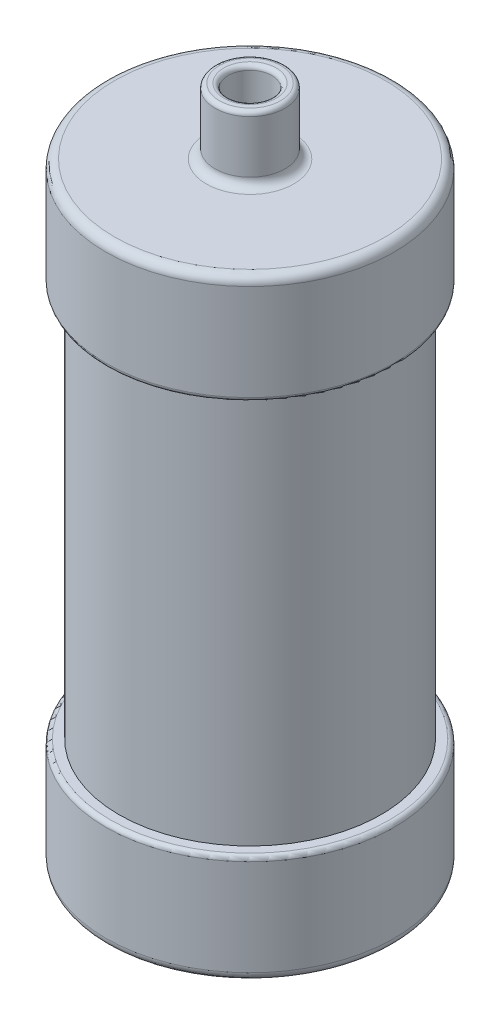
ISO-10303-21;
HEADER;
FILE_DESCRIPTION(('STEP AP214'),'2;1');
FILE_NAME('part.step','',(''),(''),'','','');
FILE_SCHEMA(('AUTOMOTIVE_DESIGN { 1 0 10303 214 1 1 1 1 }'));
ENDSEC;
DATA;
#1=APPLICATION_CONTEXT('core data for automotive mechanical design processes');
#2=APPLICATION_PROTOCOL_DEFINITION('international standard','automotive_design',2000,#1);
#3=PRODUCT_CONTEXT('',#1,'mechanical');
#4=PRODUCT('Part','Part','',(#3));
#5=PRODUCT_RELATED_PRODUCT_CATEGORY('part','',(#4));
#6=PRODUCT_DEFINITION_FORMATION('','',#4);
#7=PRODUCT_DEFINITION_CONTEXT('part definition',#1,'design');
#8=PRODUCT_DEFINITION('design','',#6,#7);
#9=PRODUCT_DEFINITION_SHAPE('','',#8);
#10=(LENGTH_UNIT() NAMED_UNIT(*) SI_UNIT(.MILLI.,.METRE.));
#11=(NAMED_UNIT(*) PLANE_ANGLE_UNIT() SI_UNIT($,.RADIAN.));
#12=(NAMED_UNIT(*) SI_UNIT($,.STERADIAN.) SOLID_ANGLE_UNIT());
#13=UNCERTAINTY_MEASURE_WITH_UNIT(LENGTH_MEASURE(1.E-05),#10,'distance_accuracy_value','');
#14=(GEOMETRIC_REPRESENTATION_CONTEXT(3) GLOBAL_UNCERTAINTY_ASSIGNED_CONTEXT((#13)) GLOBAL_UNIT_ASSIGNED_CONTEXT((#10,
#11,#12)) REPRESENTATION_CONTEXT('',''));
#15=CARTESIAN_POINT('',(0.,0.,0.));
#16=DIRECTION('',(0.,0.,1.));
#17=DIRECTION('',(1.,0.,0.));
#18=AXIS2_PLACEMENT_3D('',#15,#16,#17);
#19=CARTESIAN_POINT('',(0.,-70.,0.));
#20=DIRECTION('',(0.,-1.,0.));
#21=DIRECTION('',(0.,0.,1.));
#22=AXIS2_PLACEMENT_3D('',#19,#20,#21);
#23=PLANE('',#22);
#24=CARTESIAN_POINT('',(0.,-70.,0.));
#25=DIRECTION('',(0.,1.,0.));
#26=DIRECTION('',(0.,0.,1.));
#27=AXIS2_PLACEMENT_3D('',#24,#25,#26);
#28=CIRCLE('',#27,10.);
#29=CARTESIAN_POINT('',(0.,-70.,10.));
#30=VERTEX_POINT('',#29);
#31=EDGE_CURVE('E85',#30,#30,#28,.F.);
#32=ORIENTED_EDGE('',*,*,#31,.F.);
#33=EDGE_LOOP('',(#32));
#34=FACE_BOUND('',#33,.T.);
#35=CARTESIAN_POINT('',(0.,-70.,0.));
#36=DIRECTION('',(0.,1.,0.));
#37=DIRECTION('',(0.,0.,1.));
#38=AXIS2_PLACEMENT_3D('',#35,#36,#37);
#39=CIRCLE('',#38,31.);
#40=CARTESIAN_POINT('',(0.,-70.,31.));
#41=VERTEX_POINT('',#40);
#42=EDGE_CURVE('E88',#41,#41,#39,.T.);
#43=ORIENTED_EDGE('',*,*,#42,.F.);
#44=EDGE_LOOP('',(#43));
#45=FACE_BOUND('',#44,.T.);
#46=ADVANCED_FACE('F56',(#34,#45),#23,.T.);
#47=CARTESIAN_POINT('',(0.,-45.,0.));
#48=DIRECTION('',(0.,-1.,0.));
#49=DIRECTION('',(0.,0.,1.));
#50=AXIS2_PLACEMENT_3D('',#47,#48,#49);
#51=CYLINDRICAL_SURFACE('',#50,33.);
#52=CARTESIAN_POINT('',(0.,-46.,0.));
#53=DIRECTION('',(0.,1.,0.));
#54=DIRECTION('',(0.,0.,1.));
#55=AXIS2_PLACEMENT_3D('',#52,#53,#54);
#56=CIRCLE('',#55,33.);
#57=CARTESIAN_POINT('',(0.,-46.,33.));
#58=VERTEX_POINT('',#57);
#59=EDGE_CURVE('E79',#58,#58,#56,.T.);
#60=ORIENTED_EDGE('',*,*,#59,.F.);
#61=EDGE_LOOP('',(#60));
#62=FACE_BOUND('',#61,.T.);
#63=CARTESIAN_POINT('',(0.,-68.,0.));
#64=DIRECTION('',(0.,1.,0.));
#65=DIRECTION('',(0.,0.,1.));
#66=AXIS2_PLACEMENT_3D('',#63,#64,#65);
#67=CIRCLE('',#66,33.);
#68=CARTESIAN_POINT('',(0.,-68.,33.));
#69=VERTEX_POINT('',#68);
#70=EDGE_CURVE('E82',#69,#69,#67,.F.);
#71=ORIENTED_EDGE('',*,*,#70,.F.);
#72=EDGE_LOOP('',(#71));
#73=FACE_BOUND('',#72,.T.);
#74=ADVANCED_FACE('F124',(#62,#73),#51,.T.);
#75=CARTESIAN_POINT('',(0.,-45.,0.));
#76=DIRECTION('',(0.,-1.,0.));
#77=DIRECTION('',(0.,0.,1.));
#78=AXIS2_PLACEMENT_3D('',#75,#76,#77);
#79=PLANE('',#78);
#80=CARTESIAN_POINT('',(0.,-45.,0.));
#81=DIRECTION('',(0.,1.,0.));
#82=DIRECTION('',(0.,0.,1.));
#83=AXIS2_PLACEMENT_3D('',#80,#81,#82);
#84=CIRCLE('',#83,32.);
#85=CARTESIAN_POINT('',(0.,-45.,32.));
#86=VERTEX_POINT('',#85);
#87=EDGE_CURVE('E76',#86,#86,#84,.F.);
#88=ORIENTED_EDGE('',*,*,#87,.F.);
#89=EDGE_LOOP('',(#88));
#90=FACE_BOUND('',#89,.T.);
#91=CARTESIAN_POINT('',(0.,-45.,0.));
#92=DIRECTION('',(0.,1.,0.));
#93=DIRECTION('',(0.,0.,1.));
#94=AXIS2_PLACEMENT_3D('',#91,#92,#93);
#95=CIRCLE('',#94,30.);
#96=CARTESIAN_POINT('',(0.,-45.,30.));
#97=VERTEX_POINT('',#96);
#98=EDGE_CURVE('E94',#97,#97,#95,.T.);
#99=ORIENTED_EDGE('',*,*,#98,.F.);
#100=EDGE_LOOP('',(#99));
#101=FACE_BOUND('',#100,.T.);
#102=ADVANCED_FACE('F118',(#90,#101),#79,.F.);
#103=CARTESIAN_POINT('',(0.,-45.,0.));
#104=DIRECTION('',(0.,-1.,0.));
#105=DIRECTION('',(0.,0.,1.));
#106=AXIS2_PLACEMENT_3D('',#103,#104,#105);
#107=CYLINDRICAL_SURFACE('',#106,30.);
#108=ORIENTED_EDGE('',*,*,#98,.T.);
#109=EDGE_LOOP('',(#108));
#110=FACE_BOUND('',#109,.T.);
#111=CARTESIAN_POINT('',(0.,-60.,0.));
#112=DIRECTION('',(0.,1.,0.));
#113=DIRECTION('',(0.,0.,1.));
#114=AXIS2_PLACEMENT_3D('',#111,#112,#113);
#115=CIRCLE('',#114,30.);
#116=CARTESIAN_POINT('',(0.,-60.,30.));
#117=VERTEX_POINT('',#116);
#118=EDGE_CURVE('E98',#117,#117,#115,.F.);
#119=ORIENTED_EDGE('',*,*,#118,.T.);
#120=EDGE_LOOP('',(#119));
#121=FACE_BOUND('',#120,.T.);
#122=ADVANCED_FACE('F104',(#110,#121),#107,.F.);
#123=CARTESIAN_POINT('',(0.,-60.,0.));
#124=DIRECTION('',(0.,-1.,0.));
#125=DIRECTION('',(0.,0.,1.));
#126=AXIS2_PLACEMENT_3D('',#123,#124,#125);
#127=PLANE('',#126);
#128=CARTESIAN_POINT('',(0.,-60.,0.));
#129=DIRECTION('',(0.,1.,0.));
#130=DIRECTION('',(0.,0.,1.));
#131=AXIS2_PLACEMENT_3D('',#128,#129,#130);
#132=CIRCLE('',#131,5.);
#133=CARTESIAN_POINT('',(0.,-60.,5.));
#134=VERTEX_POINT('',#133);
#135=EDGE_CURVE('E95',#134,#134,#132,.T.);
#136=ORIENTED_EDGE('',*,*,#135,.F.);
#137=EDGE_LOOP('',(#136));
#138=FACE_BOUND('',#137,.T.);
#139=ORIENTED_EDGE('',*,*,#118,.F.);
#140=EDGE_LOOP('',(#139));
#141=FACE_BOUND('',#140,.T.);
#142=ADVANCED_FACE('F106',(#138,#141),#127,.F.);
#143=CARTESIAN_POINT('',(0.,-85.,0.));
#144=DIRECTION('',(0.,-1.,0.));
#145=DIRECTION('',(0.,0.,1.));
#146=AXIS2_PLACEMENT_3D('',#143,#144,#145);
#147=PLANE('',#146);
#148=CARTESIAN_POINT('',(0.,-85.,0.));
#149=DIRECTION('',(0.,1.,0.));
#150=DIRECTION('',(0.,0.,1.));
#151=AXIS2_PLACEMENT_3D('',#148,#149,#150);
#152=CIRCLE('',#151,6.);
#153=CARTESIAN_POINT('',(0.,-85.,6.));
#154=VERTEX_POINT('',#153);
#155=EDGE_CURVE('E63',#154,#154,#152,.F.);
#156=ORIENTED_EDGE('',*,*,#155,.F.);
#157=EDGE_LOOP('',(#156));
#158=FACE_BOUND('',#157,.T.);
#159=CARTESIAN_POINT('',(0.,-85.,0.));
#160=DIRECTION('',(0.,1.,0.));
#161=DIRECTION('',(0.,0.,1.));
#162=AXIS2_PLACEMENT_3D('',#159,#160,#161);
#163=CIRCLE('',#162,7.);
#164=CARTESIAN_POINT('',(0.,-85.,7.));
#165=VERTEX_POINT('',#164);
#166=EDGE_CURVE('E67',#165,#165,#163,.T.);
#167=ORIENTED_EDGE('',*,*,#166,.F.);
#168=EDGE_LOOP('',(#167));
#169=FACE_BOUND('',#168,.T.);
#170=ADVANCED_FACE('F108',(#158,#169),#147,.T.);
#171=CARTESIAN_POINT('',(0.,-85.,0.));
#172=DIRECTION('',(0.,1.,0.));
#173=DIRECTION('',(0.,0.,-1.));
#174=AXIS2_PLACEMENT_3D('',#171,#172,#173);
#175=CYLINDRICAL_SURFACE('',#174,8.);
#176=CARTESIAN_POINT('',(0.,-84.,0.));
#177=DIRECTION('',(0.,1.,0.));
#178=DIRECTION('',(0.,0.,1.));
#179=AXIS2_PLACEMENT_3D('',#176,#177,#178);
#180=CIRCLE('',#179,8.);
#181=CARTESIAN_POINT('',(0.,-84.,8.));
#182=VERTEX_POINT('',#181);
#183=EDGE_CURVE('E12',#182,#182,#180,.F.);
#184=ORIENTED_EDGE('',*,*,#183,.F.);
#185=EDGE_LOOP('',(#184));
#186=FACE_BOUND('',#185,.T.);
#187=CARTESIAN_POINT('',(0.,-72.,0.));
#188=DIRECTION('',(0.,1.,0.));
#189=DIRECTION('',(0.,0.,1.));
#190=AXIS2_PLACEMENT_3D('',#187,#188,#189);
#191=CIRCLE('',#190,8.);
#192=CARTESIAN_POINT('',(0.,-72.,8.));
#193=VERTEX_POINT('',#192);
#194=EDGE_CURVE('E91',#193,#193,#191,.T.);
#195=ORIENTED_EDGE('',*,*,#194,.F.);
#196=EDGE_LOOP('',(#195));
#197=FACE_BOUND('',#196,.T.);
#198=ADVANCED_FACE('F115',(#186,#197),#175,.T.);
#199=CARTESIAN_POINT('',(0.,-85.,0.));
#200=DIRECTION('',(0.,1.,0.));
#201=DIRECTION('',(0.,0.,-1.));
#202=AXIS2_PLACEMENT_3D('',#199,#200,#201);
#203=CYLINDRICAL_SURFACE('',#202,5.);
#204=CARTESIAN_POINT('',(0.,-84.,0.));
#205=DIRECTION('',(0.,1.,0.));
#206=DIRECTION('',(0.,0.,1.));
#207=AXIS2_PLACEMENT_3D('',#204,#205,#206);
#208=CIRCLE('',#207,5.);
#209=CARTESIAN_POINT('',(0.,-84.,5.));
#210=VERTEX_POINT('',#209);
#211=EDGE_CURVE('E71',#210,#210,#208,.T.);
#212=ORIENTED_EDGE('',*,*,#211,.F.);
#213=EDGE_LOOP('',(#212));
#214=FACE_BOUND('',#213,.T.);
#215=ORIENTED_EDGE('',*,*,#135,.T.);
#216=EDGE_LOOP('',(#215));
#217=FACE_BOUND('',#216,.T.);
#218=ADVANCED_FACE('F135',(#214,#217),#203,.F.);
#219=CARTESIAN_POINT('',(0.,-72.,0.));
#220=DIRECTION('',(0.,-1.,0.));
#221=DIRECTION('',(0.,0.,1.));
#222=AXIS2_PLACEMENT_3D('',#219,#220,#221);
#223=TOROIDAL_SURFACE('',#222,10.,2.);
#224=ORIENTED_EDGE('',*,*,#31,.T.);
#225=EDGE_LOOP('',(#224));
#226=FACE_BOUND('',#225,.T.);
#227=ORIENTED_EDGE('',*,*,#194,.T.);
#228=EDGE_LOOP('',(#227));
#229=FACE_BOUND('',#228,.T.);
#230=ADVANCED_FACE('F139',(#226,#229),#223,.F.);
#231=CARTESIAN_POINT('',(0.,-68.,0.));
#232=DIRECTION('',(0.,-1.,0.));
#233=DIRECTION('',(0.,0.,1.));
#234=AXIS2_PLACEMENT_3D('',#231,#232,#233);
#235=TOROIDAL_SURFACE('',#234,31.,2.);
#236=ORIENTED_EDGE('',*,*,#70,.T.);
#237=EDGE_LOOP('',(#236));
#238=FACE_BOUND('',#237,.T.);
#239=ORIENTED_EDGE('',*,*,#42,.T.);
#240=EDGE_LOOP('',(#239));
#241=FACE_BOUND('',#240,.T.);
#242=ADVANCED_FACE('F144',(#238,#241),#235,.T.);
#243=CARTESIAN_POINT('',(0.,-46.,0.));
#244=DIRECTION('',(0.,-1.,0.));
#245=DIRECTION('',(0.,0.,1.));
#246=AXIS2_PLACEMENT_3D('',#243,#244,#245);
#247=TOROIDAL_SURFACE('',#246,32.,1.);
#248=ORIENTED_EDGE('',*,*,#87,.T.);
#249=EDGE_LOOP('',(#248));
#250=FACE_BOUND('',#249,.T.);
#251=ORIENTED_EDGE('',*,*,#59,.T.);
#252=EDGE_LOOP('',(#251));
#253=FACE_BOUND('',#252,.T.);
#254=ADVANCED_FACE('F152',(#250,#253),#247,.T.);
#255=CARTESIAN_POINT('',(0.,-84.,0.));
#256=DIRECTION('',(0.,-1.,0.));
#257=DIRECTION('',(0.,0.,1.));
#258=AXIS2_PLACEMENT_3D('',#255,#256,#257);
#259=TOROIDAL_SURFACE('',#258,6.,1.);
#260=ORIENTED_EDGE('',*,*,#155,.T.);
#261=EDGE_LOOP('',(#260));
#262=FACE_BOUND('',#261,.T.);
#263=ORIENTED_EDGE('',*,*,#211,.T.);
#264=EDGE_LOOP('',(#263));
#265=FACE_BOUND('',#264,.T.);
#266=ADVANCED_FACE('F150',(#262,#265),#259,.T.);
#267=CARTESIAN_POINT('',(0.,-84.,0.));
#268=DIRECTION('',(0.,-1.,0.));
#269=DIRECTION('',(0.,0.,1.));
#270=AXIS2_PLACEMENT_3D('',#267,#268,#269);
#271=TOROIDAL_SURFACE('',#270,7.,1.);
#272=ORIENTED_EDGE('',*,*,#183,.T.);
#273=EDGE_LOOP('',(#272));
#274=FACE_BOUND('',#273,.T.);
#275=ORIENTED_EDGE('',*,*,#166,.T.);
#276=EDGE_LOOP('',(#275));
#277=FACE_BOUND('',#276,.T.);
#278=ADVANCED_FACE('F58',(#274,#277),#271,.T.);
#279=CLOSED_SHELL('',(#46,#74,#102,#122,#142,#170,#198,#218,#230,#242,#254,#266,#278));
#280=MANIFOLD_SOLID_BREP('B2',#279);
#281=CARTESIAN_POINT('',(0.,70.,0.));
#282=DIRECTION('',(0.,1.,0.));
#283=DIRECTION('',(0.,0.,1.));
#284=AXIS2_PLACEMENT_3D('',#281,#282,#283);
#285=PLANE('',#284);
#286=CARTESIAN_POINT('',(0.,70.,0.));
#287=DIRECTION('',(0.,1.,0.));
#288=DIRECTION('',(0.,0.,1.));
#289=AXIS2_PLACEMENT_3D('',#286,#287,#288);
#290=CIRCLE('',#289,10.);
#291=CARTESIAN_POINT('',(0.,70.,10.));
#292=VERTEX_POINT('',#291);
#293=EDGE_CURVE('E308',#292,#292,#290,.F.);
#294=ORIENTED_EDGE('',*,*,#293,.T.);
#295=EDGE_LOOP('',(#294));
#296=FACE_BOUND('',#295,.T.);
#297=CARTESIAN_POINT('',(0.,70.,0.));
#298=DIRECTION('',(0.,1.,0.));
#299=DIRECTION('',(0.,0.,1.));
#300=AXIS2_PLACEMENT_3D('',#297,#298,#299);
#301=CIRCLE('',#300,31.);
#302=CARTESIAN_POINT('',(0.,70.,31.));
#303=VERTEX_POINT('',#302);
#304=EDGE_CURVE('E311',#303,#303,#301,.T.);
#305=ORIENTED_EDGE('',*,*,#304,.T.);
#306=EDGE_LOOP('',(#305));
#307=FACE_BOUND('',#306,.T.);
#308=ADVANCED_FACE('F279',(#296,#307),#285,.T.);
#309=CARTESIAN_POINT('',(0.,45.,0.));
#310=DIRECTION('',(0.,1.,0.));
#311=DIRECTION('',(0.,0.,1.));
#312=AXIS2_PLACEMENT_3D('',#309,#310,#311);
#313=CYLINDRICAL_SURFACE('',#312,33.);
#314=CARTESIAN_POINT('',(0.,46.,0.));
#315=DIRECTION('',(0.,1.,0.));
#316=DIRECTION('',(0.,0.,1.));
#317=AXIS2_PLACEMENT_3D('',#314,#315,#316);
#318=CIRCLE('',#317,33.);
#319=CARTESIAN_POINT('',(0.,46.,33.));
#320=VERTEX_POINT('',#319);
#321=EDGE_CURVE('E302',#320,#320,#318,.T.);
#322=ORIENTED_EDGE('',*,*,#321,.T.);
#323=EDGE_LOOP('',(#322));
#324=FACE_BOUND('',#323,.T.);
#325=CARTESIAN_POINT('',(0.,68.,0.));
#326=DIRECTION('',(0.,1.,0.));
#327=DIRECTION('',(0.,0.,1.));
#328=AXIS2_PLACEMENT_3D('',#325,#326,#327);
#329=CIRCLE('',#328,33.);
#330=CARTESIAN_POINT('',(0.,68.,33.));
#331=VERTEX_POINT('',#330);
#332=EDGE_CURVE('E305',#331,#331,#329,.F.);
#333=ORIENTED_EDGE('',*,*,#332,.T.);
#334=EDGE_LOOP('',(#333));
#335=FACE_BOUND('',#334,.T.);
#336=ADVANCED_FACE('F341',(#324,#335),#313,.T.);
#337=CARTESIAN_POINT('',(0.,45.,0.));
#338=DIRECTION('',(0.,1.,0.));
#339=DIRECTION('',(0.,0.,1.));
#340=AXIS2_PLACEMENT_3D('',#337,#338,#339);
#341=PLANE('',#340);
#342=CARTESIAN_POINT('',(0.,45.,0.));
#343=DIRECTION('',(0.,1.,0.));
#344=DIRECTION('',(0.,0.,1.));
#345=AXIS2_PLACEMENT_3D('',#342,#343,#344);
#346=CIRCLE('',#345,32.);
#347=CARTESIAN_POINT('',(0.,45.,32.));
#348=VERTEX_POINT('',#347);
#349=EDGE_CURVE('E299',#348,#348,#346,.F.);
#350=ORIENTED_EDGE('',*,*,#349,.T.);
#351=EDGE_LOOP('',(#350));
#352=FACE_BOUND('',#351,.T.);
#353=CARTESIAN_POINT('',(0.,45.,0.));
#354=DIRECTION('',(0.,1.,0.));
#355=DIRECTION('',(0.,0.,1.));
#356=AXIS2_PLACEMENT_3D('',#353,#354,#355);
#357=CIRCLE('',#356,30.);
#358=CARTESIAN_POINT('',(0.,45.,30.));
#359=VERTEX_POINT('',#358);
#360=EDGE_CURVE('E317',#359,#359,#357,.T.);
#361=ORIENTED_EDGE('',*,*,#360,.T.);
#362=EDGE_LOOP('',(#361));
#363=FACE_BOUND('',#362,.T.);
#364=ADVANCED_FACE('F331',(#352,#363),#341,.F.);
#365=CARTESIAN_POINT('',(0.,45.,0.));
#366=DIRECTION('',(0.,1.,0.));
#367=DIRECTION('',(0.,0.,1.));
#368=AXIS2_PLACEMENT_3D('',#365,#366,#367);
#369=CYLINDRICAL_SURFACE('',#368,30.);
#370=ORIENTED_EDGE('',*,*,#360,.F.);
#371=EDGE_LOOP('',(#370));
#372=FACE_BOUND('',#371,.T.);
#373=CARTESIAN_POINT('',(0.,60.,0.));
#374=DIRECTION('',(0.,1.,0.));
#375=DIRECTION('',(0.,0.,1.));
#376=AXIS2_PLACEMENT_3D('',#373,#374,#375);
#377=CIRCLE('',#376,30.);
#378=CARTESIAN_POINT('',(0.,60.,30.));
#379=VERTEX_POINT('',#378);
#380=EDGE_CURVE('E321',#379,#379,#377,.F.);
#381=ORIENTED_EDGE('',*,*,#380,.F.);
#382=EDGE_LOOP('',(#381));
#383=FACE_BOUND('',#382,.T.);
#384=ADVANCED_FACE('F329',(#372,#383),#369,.F.);
#385=CARTESIAN_POINT('',(0.,60.,0.));
#386=DIRECTION('',(0.,1.,0.));
#387=DIRECTION('',(0.,0.,1.));
#388=AXIS2_PLACEMENT_3D('',#385,#386,#387);
#389=PLANE('',#388);
#390=CARTESIAN_POINT('',(0.,60.,0.));
#391=DIRECTION('',(0.,1.,0.));
#392=DIRECTION('',(0.,0.,1.));
#393=AXIS2_PLACEMENT_3D('',#390,#391,#392);
#394=CIRCLE('',#393,5.);
#395=CARTESIAN_POINT('',(0.,60.,5.));
#396=VERTEX_POINT('',#395);
#397=EDGE_CURVE('E318',#396,#396,#394,.T.);
#398=ORIENTED_EDGE('',*,*,#397,.T.);
#399=EDGE_LOOP('',(#398));
#400=FACE_BOUND('',#399,.T.);
#401=ORIENTED_EDGE('',*,*,#380,.T.);
#402=EDGE_LOOP('',(#401));
#403=FACE_BOUND('',#402,.T.);
#404=ADVANCED_FACE('F327',(#400,#403),#389,.F.);
#405=CARTESIAN_POINT('',(0.,85.,0.));
#406=DIRECTION('',(0.,1.,0.));
#407=DIRECTION('',(0.,0.,1.));
#408=AXIS2_PLACEMENT_3D('',#405,#406,#407);
#409=PLANE('',#408);
#410=CARTESIAN_POINT('',(0.,85.,0.));
#411=DIRECTION('',(0.,1.,0.));
#412=DIRECTION('',(0.,0.,1.));
#413=AXIS2_PLACEMENT_3D('',#410,#411,#412);
#414=CIRCLE('',#413,6.);
#415=CARTESIAN_POINT('',(0.,85.,6.));
#416=VERTEX_POINT('',#415);
#417=EDGE_CURVE('E286',#416,#416,#414,.F.);
#418=ORIENTED_EDGE('',*,*,#417,.T.);
#419=EDGE_LOOP('',(#418));
#420=FACE_BOUND('',#419,.T.);
#421=CARTESIAN_POINT('',(0.,85.,0.));
#422=DIRECTION('',(0.,1.,0.));
#423=DIRECTION('',(0.,0.,1.));
#424=AXIS2_PLACEMENT_3D('',#421,#422,#423);
#425=CIRCLE('',#424,7.);
#426=CARTESIAN_POINT('',(0.,85.,7.));
#427=VERTEX_POINT('',#426);
#428=EDGE_CURVE('E290',#427,#427,#425,.T.);
#429=ORIENTED_EDGE('',*,*,#428,.T.);
#430=EDGE_LOOP('',(#429));
#431=FACE_BOUND('',#430,.T.);
#432=ADVANCED_FACE('F338',(#420,#431),#409,.T.);
#433=CARTESIAN_POINT('',(0.,85.,0.));
#434=DIRECTION('',(0.,-1.,0.));
#435=DIRECTION('',(0.,0.,-1.));
#436=AXIS2_PLACEMENT_3D('',#433,#434,#435);
#437=CYLINDRICAL_SURFACE('',#436,8.);
#438=CARTESIAN_POINT('',(0.,84.,0.));
#439=DIRECTION('',(0.,1.,0.));
#440=DIRECTION('',(0.,0.,1.));
#441=AXIS2_PLACEMENT_3D('',#438,#439,#440);
#442=CIRCLE('',#441,8.);
#443=CARTESIAN_POINT('',(0.,84.,8.));
#444=VERTEX_POINT('',#443);
#445=EDGE_CURVE('E55',#444,#444,#442,.F.);
#446=ORIENTED_EDGE('',*,*,#445,.T.);
#447=EDGE_LOOP('',(#446));
#448=FACE_BOUND('',#447,.T.);
#449=CARTESIAN_POINT('',(0.,72.,0.));
#450=DIRECTION('',(0.,1.,0.));
#451=DIRECTION('',(0.,0.,1.));
#452=AXIS2_PLACEMENT_3D('',#449,#450,#451);
#453=CIRCLE('',#452,8.);
#454=CARTESIAN_POINT('',(0.,72.,8.));
#455=VERTEX_POINT('',#454);
#456=EDGE_CURVE('E314',#455,#455,#453,.T.);
#457=ORIENTED_EDGE('',*,*,#456,.T.);
#458=EDGE_LOOP('',(#457));
#459=FACE_BOUND('',#458,.T.);
#460=ADVANCED_FACE('F355',(#448,#459),#437,.T.);
#461=CARTESIAN_POINT('',(0.,85.,0.));
#462=DIRECTION('',(0.,-1.,0.));
#463=DIRECTION('',(0.,0.,-1.));
#464=AXIS2_PLACEMENT_3D('',#461,#462,#463);
#465=CYLINDRICAL_SURFACE('',#464,5.);
#466=CARTESIAN_POINT('',(0.,84.,0.));
#467=DIRECTION('',(0.,1.,0.));
#468=DIRECTION('',(0.,0.,1.));
#469=AXIS2_PLACEMENT_3D('',#466,#467,#468);
#470=CIRCLE('',#469,5.);
#471=CARTESIAN_POINT('',(0.,84.,5.));
#472=VERTEX_POINT('',#471);
#473=EDGE_CURVE('E294',#472,#472,#470,.T.);
#474=ORIENTED_EDGE('',*,*,#473,.T.);
#475=EDGE_LOOP('',(#474));
#476=FACE_BOUND('',#475,.T.);
#477=ORIENTED_EDGE('',*,*,#397,.F.);
#478=EDGE_LOOP('',(#477));
#479=FACE_BOUND('',#478,.T.);
#480=ADVANCED_FACE('F358',(#476,#479),#465,.F.);
#481=CARTESIAN_POINT('',(0.,72.,0.));
#482=DIRECTION('',(0.,1.,0.));
#483=DIRECTION('',(0.,0.,1.));
#484=AXIS2_PLACEMENT_3D('',#481,#482,#483);
#485=TOROIDAL_SURFACE('',#484,10.,2.);
#486=ORIENTED_EDGE('',*,*,#293,.F.);
#487=EDGE_LOOP('',(#486));
#488=FACE_BOUND('',#487,.T.);
#489=ORIENTED_EDGE('',*,*,#456,.F.);
#490=EDGE_LOOP('',(#489));
#491=FACE_BOUND('',#490,.T.);
#492=ADVANCED_FACE('F362',(#488,#491),#485,.F.);
#493=CARTESIAN_POINT('',(0.,68.,0.));
#494=DIRECTION('',(0.,1.,0.));
#495=DIRECTION('',(0.,0.,1.));
#496=AXIS2_PLACEMENT_3D('',#493,#494,#495);
#497=TOROIDAL_SURFACE('',#496,31.,2.);
#498=ORIENTED_EDGE('',*,*,#332,.F.);
#499=EDGE_LOOP('',(#498));
#500=FACE_BOUND('',#499,.T.);
#501=ORIENTED_EDGE('',*,*,#304,.F.);
#502=EDGE_LOOP('',(#501));
#503=FACE_BOUND('',#502,.T.);
#504=ADVANCED_FACE('F367',(#500,#503),#497,.T.);
#505=CARTESIAN_POINT('',(0.,46.,0.));
#506=DIRECTION('',(0.,1.,0.));
#507=DIRECTION('',(0.,0.,1.));
#508=AXIS2_PLACEMENT_3D('',#505,#506,#507);
#509=TOROIDAL_SURFACE('',#508,32.,1.);
#510=ORIENTED_EDGE('',*,*,#349,.F.);
#511=EDGE_LOOP('',(#510));
#512=FACE_BOUND('',#511,.T.);
#513=ORIENTED_EDGE('',*,*,#321,.F.);
#514=EDGE_LOOP('',(#513));
#515=FACE_BOUND('',#514,.T.);
#516=ADVANCED_FACE('F376',(#512,#515),#509,.T.);
#517=CARTESIAN_POINT('',(0.,84.,0.));
#518=DIRECTION('',(0.,1.,0.));
#519=DIRECTION('',(0.,0.,1.));
#520=AXIS2_PLACEMENT_3D('',#517,#518,#519);
#521=TOROIDAL_SURFACE('',#520,6.,1.);
#522=ORIENTED_EDGE('',*,*,#417,.F.);
#523=EDGE_LOOP('',(#522));
#524=FACE_BOUND('',#523,.T.);
#525=ORIENTED_EDGE('',*,*,#473,.F.);
#526=EDGE_LOOP('',(#525));
#527=FACE_BOUND('',#526,.T.);
#528=ADVANCED_FACE('F374',(#524,#527),#521,.T.);
#529=CARTESIAN_POINT('',(0.,84.,0.));
#530=DIRECTION('',(0.,1.,0.));
#531=DIRECTION('',(0.,0.,1.));
#532=AXIS2_PLACEMENT_3D('',#529,#530,#531);
#533=TOROIDAL_SURFACE('',#532,7.,1.);
#534=ORIENTED_EDGE('',*,*,#445,.F.);
#535=EDGE_LOOP('',(#534));
#536=FACE_BOUND('',#535,.T.);
#537=ORIENTED_EDGE('',*,*,#428,.F.);
#538=EDGE_LOOP('',(#537));
#539=FACE_BOUND('',#538,.T.);
#540=ADVANCED_FACE('F281',(#536,#539),#533,.T.);
#541=CLOSED_SHELL('',(#308,#336,#364,#384,#404,#432,#460,#480,#492,#504,#516,#528,#540));
#542=MANIFOLD_SOLID_BREP('B7',#541);
#543=CARTESIAN_POINT('',(0.,-60.,0.));
#544=DIRECTION('',(0.,1.,0.));
#545=DIRECTION('',(0.,0.,1.));
#546=AXIS2_PLACEMENT_3D('',#543,#544,#545);
#547=CYLINDRICAL_SURFACE('',#546,30.);
#548=CARTESIAN_POINT('',(0.,-60.,0.));
#549=DIRECTION('',(0.,1.,0.));
#550=DIRECTION('',(0.,0.,1.));
#551=AXIS2_PLACEMENT_3D('',#548,#549,#550);
#552=CIRCLE('',#551,30.);
#553=CARTESIAN_POINT('',(0.,-60.,30.));
#554=VERTEX_POINT('',#553);
#555=EDGE_CURVE('E278',#554,#554,#552,.T.);
#556=ORIENTED_EDGE('',*,*,#555,.T.);
#557=EDGE_LOOP('',(#556));
#558=FACE_BOUND('',#557,.T.);
#559=CARTESIAN_POINT('',(0.,60.,0.));
#560=DIRECTION('',(0.,1.,0.));
#561=DIRECTION('',(0.,0.,1.));
#562=AXIS2_PLACEMENT_3D('',#559,#560,#561);
#563=CIRCLE('',#562,30.);
#564=CARTESIAN_POINT('',(0.,60.,30.));
#565=VERTEX_POINT('',#564);
#566=EDGE_CURVE('E492',#565,#565,#563,.T.);
#567=ORIENTED_EDGE('',*,*,#566,.F.);
#568=EDGE_LOOP('',(#567));
#569=FACE_BOUND('',#568,.T.);
#570=ADVANCED_FACE('F482',(#558,#569),#547,.T.);
#571=CARTESIAN_POINT('',(0.,-60.,0.));
#572=DIRECTION('',(0.,1.,0.));
#573=DIRECTION('',(0.,0.,1.));
#574=AXIS2_PLACEMENT_3D('',#571,#572,#573);
#575=PLANE('',#574);
#576=CARTESIAN_POINT('',(0.,-60.,0.));
#577=DIRECTION('',(0.,1.,0.));
#578=DIRECTION('',(1.,0.,0.));
#579=AXIS2_PLACEMENT_3D('',#576,#577,#578);
#580=CIRCLE('',#579,27.);
#581=CARTESIAN_POINT('',(27.,-60.,0.));
#582=VERTEX_POINT('',#581);
#583=EDGE_CURVE('E488',#582,#582,#580,.T.);
#584=ORIENTED_EDGE('',*,*,#583,.T.);
#585=EDGE_LOOP('',(#584));
#586=FACE_BOUND('',#585,.T.);
#587=ORIENTED_EDGE('',*,*,#555,.F.);
#588=EDGE_LOOP('',(#587));
#589=FACE_BOUND('',#588,.T.);
#590=ADVANCED_FACE('F511',(#586,#589),#575,.F.);
#591=CARTESIAN_POINT('',(0.,-60.,0.));
#592=DIRECTION('',(0.,1.,0.));
#593=DIRECTION('',(0.,0.,1.));
#594=AXIS2_PLACEMENT_3D('',#591,#592,#593);
#595=CYLINDRICAL_SURFACE('',#594,27.);
#596=ORIENTED_EDGE('',*,*,#583,.F.);
#597=EDGE_LOOP('',(#596));
#598=FACE_BOUND('',#597,.T.);
#599=CARTESIAN_POINT('',(0.,60.,0.));
#600=DIRECTION('',(0.,1.,0.));
#601=DIRECTION('',(1.,0.,0.));
#602=AXIS2_PLACEMENT_3D('',#599,#600,#601);
#603=CIRCLE('',#602,27.);
#604=CARTESIAN_POINT('',(27.,60.,0.));
#605=VERTEX_POINT('',#604);
#606=EDGE_CURVE('E496',#605,#605,#603,.T.);
#607=ORIENTED_EDGE('',*,*,#606,.T.);
#608=EDGE_LOOP('',(#607));
#609=FACE_BOUND('',#608,.T.);
#610=ADVANCED_FACE('F502',(#598,#609),#595,.F.);
#611=CARTESIAN_POINT('',(0.,60.,0.));
#612=DIRECTION('',(0.,1.,0.));
#613=DIRECTION('',(0.,0.,1.));
#614=AXIS2_PLACEMENT_3D('',#611,#612,#613);
#615=PLANE('',#614);
#616=ORIENTED_EDGE('',*,*,#566,.T.);
#617=EDGE_LOOP('',(#616));
#618=FACE_BOUND('',#617,.T.);
#619=ORIENTED_EDGE('',*,*,#606,.F.);
#620=EDGE_LOOP('',(#619));
#621=FACE_BOUND('',#620,.T.);
#622=ADVANCED_FACE('F504',(#618,#621),#615,.T.);
#623=CLOSED_SHELL('',(#570,#590,#610,#622));
#624=MANIFOLD_SOLID_BREP('B50',#623);
#625=ADVANCED_BREP_SHAPE_REPRESENTATION('',(#18,#280,#542,#624),#14);
#626=SHAPE_DEFINITION_REPRESENTATION(#9,#625);
ENDSEC;
END-ISO-10303-21;
